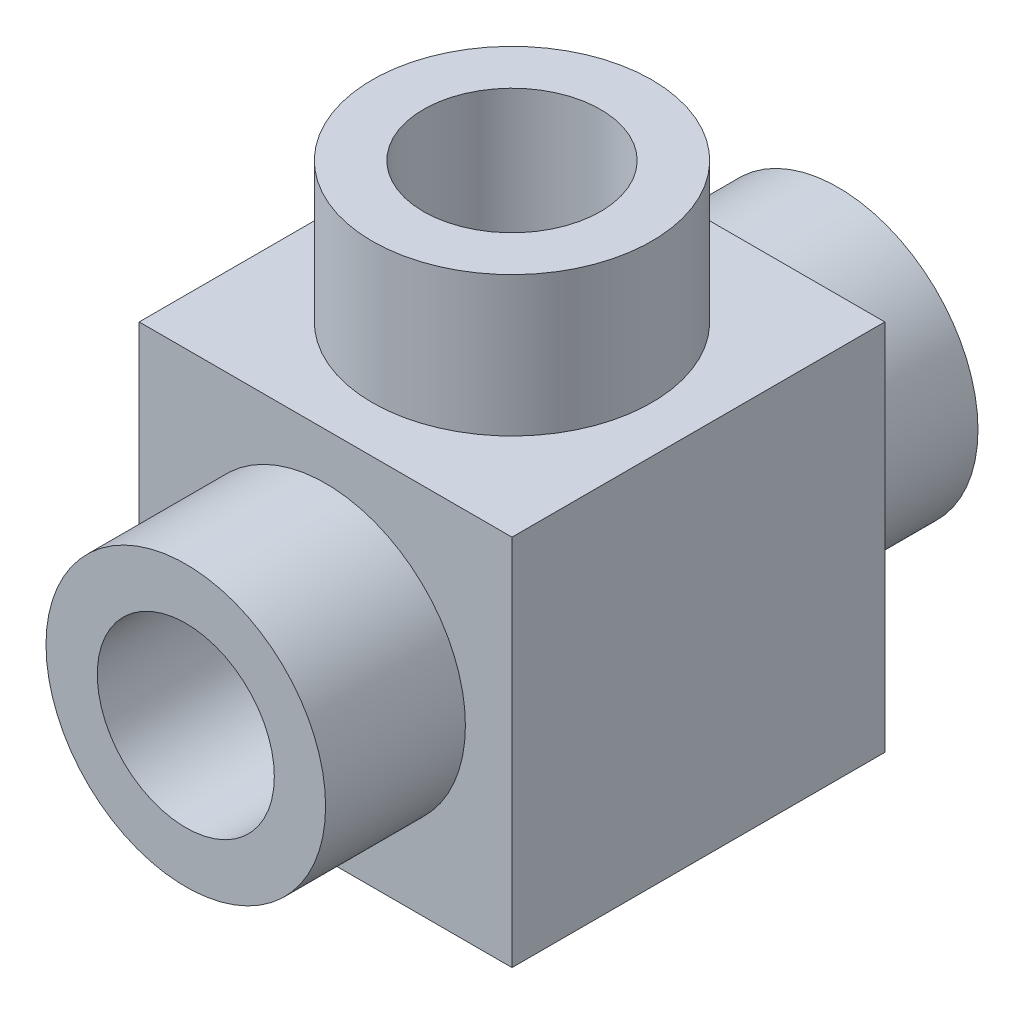
ISO-10303-21;
HEADER;
FILE_DESCRIPTION(('STEP AP214'),'2;1');
FILE_NAME('part.step','',(''),(''),'','','');
FILE_SCHEMA(('AUTOMOTIVE_DESIGN { 1 0 10303 214 1 1 1 1 }'));
ENDSEC;
DATA;
#1=APPLICATION_CONTEXT('core data for automotive mechanical design processes');
#2=APPLICATION_PROTOCOL_DEFINITION('international standard','automotive_design',2000,#1);
#3=PRODUCT_CONTEXT('',#1,'mechanical');
#4=PRODUCT('Part','Part','',(#3));
#5=PRODUCT_RELATED_PRODUCT_CATEGORY('part','',(#4));
#6=PRODUCT_DEFINITION_FORMATION('','',#4);
#7=PRODUCT_DEFINITION_CONTEXT('part definition',#1,'design');
#8=PRODUCT_DEFINITION('design','',#6,#7);
#9=PRODUCT_DEFINITION_SHAPE('','',#8);
#10=(LENGTH_UNIT() NAMED_UNIT(*) SI_UNIT(.MILLI.,.METRE.));
#11=(NAMED_UNIT(*) PLANE_ANGLE_UNIT() SI_UNIT($,.RADIAN.));
#12=(NAMED_UNIT(*) SI_UNIT($,.STERADIAN.) SOLID_ANGLE_UNIT());
#13=UNCERTAINTY_MEASURE_WITH_UNIT(LENGTH_MEASURE(1.E-05),#10,'distance_accuracy_value','');
#14=(GEOMETRIC_REPRESENTATION_CONTEXT(3) GLOBAL_UNCERTAINTY_ASSIGNED_CONTEXT((#13)) GLOBAL_UNIT_ASSIGNED_CONTEXT((#10,
#11,#12)) REPRESENTATION_CONTEXT('',''));
#15=CARTESIAN_POINT('',(0.,0.,0.));
#16=DIRECTION('',(0.,0.,1.));
#17=DIRECTION('',(1.,0.,0.));
#18=AXIS2_PLACEMENT_3D('',#15,#16,#17);
#19=CARTESIAN_POINT('',(0.,0.,30.));
#20=DIRECTION('',(0.,0.,1.));
#21=DIRECTION('',(1.,0.,0.));
#22=AXIS2_PLACEMENT_3D('',#19,#20,#21);
#23=PLANE('',#22);
#24=CARTESIAN_POINT('',(0.,0.,30.));
#25=DIRECTION('',(0.,0.,1.));
#26=DIRECTION('',(1.,0.,0.));
#27=AXIS2_PLACEMENT_3D('',#24,#25,#26);
#28=CIRCLE('',#27,30.);
#29=CARTESIAN_POINT('',(30.,0.,30.));
#30=VERTEX_POINT('',#29);
#31=EDGE_CURVE('E123',#30,#30,#28,.T.);
#32=ORIENTED_EDGE('',*,*,#31,.T.);
#33=EDGE_LOOP('',(#32));
#34=FACE_BOUND('',#33,.T.);
#35=CARTESIAN_POINT('',(0.,0.,30.));
#36=DIRECTION('',(0.,0.,1.));
#37=DIRECTION('',(1.,0.,0.));
#38=AXIS2_PLACEMENT_3D('',#35,#36,#37);
#39=CIRCLE('',#38,19.);
#40=CARTESIAN_POINT('',(19.,0.,30.));
#41=VERTEX_POINT('',#40);
#42=EDGE_CURVE('E120',#41,#41,#39,.T.);
#43=ORIENTED_EDGE('',*,*,#42,.F.);
#44=EDGE_LOOP('',(#43));
#45=FACE_BOUND('',#44,.T.);
#46=ADVANCED_FACE('F35',(#34,#45),#23,.T.);
#47=CARTESIAN_POINT('',(0.,0.,30.));
#48=DIRECTION('',(0.,0.,-1.));
#49=DIRECTION('',(-1.,0.,0.));
#50=AXIS2_PLACEMENT_3D('',#47,#48,#49);
#51=CYLINDRICAL_SURFACE('',#50,30.);
#52=ORIENTED_EDGE('',*,*,#31,.F.);
#53=EDGE_LOOP('',(#52));
#54=FACE_BOUND('',#53,.T.);
#55=CARTESIAN_POINT('',(0.,0.,0.));
#56=DIRECTION('',(0.,0.,-1.));
#57=DIRECTION('',(-1.,0.,0.));
#58=AXIS2_PLACEMENT_3D('',#55,#56,#57);
#59=CIRCLE('',#58,30.);
#60=CARTESIAN_POINT('',(-30.,0.,0.));
#61=VERTEX_POINT('',#60);
#62=EDGE_CURVE('E114',#61,#61,#59,.T.);
#63=ORIENTED_EDGE('',*,*,#62,.F.);
#64=EDGE_LOOP('',(#63));
#65=FACE_BOUND('',#64,.T.);
#66=ADVANCED_FACE('F37',(#54,#65),#51,.T.);
#67=CARTESIAN_POINT('',(0.,0.,30.));
#68=DIRECTION('',(0.,0.,-1.));
#69=DIRECTION('',(-1.,0.,0.));
#70=AXIS2_PLACEMENT_3D('',#67,#68,#69);
#71=CYLINDRICAL_SURFACE('',#70,19.);
#72=ORIENTED_EDGE('',*,*,#42,.T.);
#73=EDGE_LOOP('',(#72));
#74=FACE_BOUND('',#73,.T.);
#75=CARTESIAN_POINT('',(0.,0.,0.));
#76=DIRECTION('',(0.,0.,1.));
#77=DIRECTION('',(1.,0.,0.));
#78=AXIS2_PLACEMENT_3D('',#75,#76,#77);
#79=CIRCLE('',#78,19.);
#80=CARTESIAN_POINT('',(19.,0.,0.));
#81=VERTEX_POINT('',#80);
#82=EDGE_CURVE('E119',#81,#81,#79,.T.);
#83=ORIENTED_EDGE('',*,*,#82,.F.);
#84=EDGE_LOOP('',(#83));
#85=FACE_BOUND('',#84,.T.);
#86=ADVANCED_FACE('F157',(#74,#85),#71,.F.);
#87=CARTESIAN_POINT('',(0.,0.,0.));
#88=DIRECTION('',(0.,0.,-1.));
#89=DIRECTION('',(-1.,0.,0.));
#90=AXIS2_PLACEMENT_3D('',#87,#88,#89);
#91=PLANE('',#90);
#92=ORIENTED_EDGE('',*,*,#82,.T.);
#93=EDGE_LOOP('',(#92));
#94=FACE_BOUND('',#93,.T.);
#95=ADVANCED_FACE('F163',(#94),#91,.F.);
#96=CARTESIAN_POINT('',(-40.,40.,-80.));
#97=DIRECTION('',(-1.,0.,0.));
#98=DIRECTION('',(0.,0.,1.));
#99=AXIS2_PLACEMENT_3D('',#96,#97,#98);
#100=PLANE('',#99);
#101=DIRECTION('',(0.,-1.,0.));
#102=VECTOR('',#101,1.);
#103=CARTESIAN_POINT('',(-40.,40.,0.));
#104=LINE('',#103,#102);
#105=CARTESIAN_POINT('',(-40.,40.,0.));
#106=VERTEX_POINT('',#105);
#107=CARTESIAN_POINT('',(-40.,-40.,0.));
#108=VERTEX_POINT('',#107);
#109=EDGE_CURVE('E104',#106,#108,#104,.T.);
#110=ORIENTED_EDGE('',*,*,#109,.F.);
#111=DIRECTION('',(0.,0.,1.));
#112=VECTOR('',#111,1.);
#113=CARTESIAN_POINT('',(-40.,40.,-80.));
#114=LINE('',#113,#112);
#115=CARTESIAN_POINT('',(-40.,40.,-80.));
#116=VERTEX_POINT('',#115);
#117=EDGE_CURVE('E52',#116,#106,#114,.T.);
#118=ORIENTED_EDGE('',*,*,#117,.F.);
#119=DIRECTION('',(0.,-1.,0.));
#120=VECTOR('',#119,1.);
#121=CARTESIAN_POINT('',(-40.,40.,-80.));
#122=LINE('',#121,#120);
#123=CARTESIAN_POINT('',(-40.,-40.,-80.));
#124=VERTEX_POINT('',#123);
#125=EDGE_CURVE('E97',#116,#124,#122,.T.);
#126=ORIENTED_EDGE('',*,*,#125,.T.);
#127=DIRECTION('',(0.,0.,1.));
#128=VECTOR('',#127,1.);
#129=CARTESIAN_POINT('',(-40.,-40.,-80.));
#130=LINE('',#129,#128);
#131=EDGE_CURVE('E80',#124,#108,#130,.T.);
#132=ORIENTED_EDGE('',*,*,#131,.T.);
#133=EDGE_LOOP('',(#110,#118,#126,#132));
#134=FACE_BOUND('',#133,.T.);
#135=ADVANCED_FACE('F150',(#134),#100,.T.);
#136=CARTESIAN_POINT('',(40.,40.,-80.));
#137=DIRECTION('',(0.,1.,0.));
#138=DIRECTION('',(0.,0.,1.));
#139=AXIS2_PLACEMENT_3D('',#136,#137,#138);
#140=PLANE('',#139);
#141=CARTESIAN_POINT('',(0.,40.,-40.));
#142=DIRECTION('',(0.,1.,0.));
#143=DIRECTION('',(0.,0.,1.));
#144=AXIS2_PLACEMENT_3D('',#141,#142,#143);
#145=CIRCLE('',#144,30.);
#146=CARTESIAN_POINT('',(0.,40.,-10.));
#147=VERTEX_POINT('',#146);
#148=EDGE_CURVE('E347',#147,#147,#145,.T.);
#149=ORIENTED_EDGE('',*,*,#148,.F.);
#150=EDGE_LOOP('',(#149));
#151=FACE_BOUND('',#150,.T.);
#152=DIRECTION('',(-1.,0.,0.));
#153=VECTOR('',#152,1.);
#154=CARTESIAN_POINT('',(40.,40.,0.));
#155=LINE('',#154,#153);
#156=CARTESIAN_POINT('',(40.,40.,0.));
#157=VERTEX_POINT('',#156);
#158=EDGE_CURVE('E99',#157,#106,#155,.T.);
#159=ORIENTED_EDGE('',*,*,#158,.F.);
#160=DIRECTION('',(0.,0.,1.));
#161=VECTOR('',#160,1.);
#162=CARTESIAN_POINT('',(40.,40.,-80.));
#163=LINE('',#162,#161);
#164=CARTESIAN_POINT('',(40.,40.,-80.));
#165=VERTEX_POINT('',#164);
#166=EDGE_CURVE('E69',#165,#157,#163,.T.);
#167=ORIENTED_EDGE('',*,*,#166,.F.);
#168=DIRECTION('',(-1.,0.,0.));
#169=VECTOR('',#168,1.);
#170=CARTESIAN_POINT('',(40.,40.,-80.));
#171=LINE('',#170,#169);
#172=EDGE_CURVE('E94',#165,#116,#171,.T.);
#173=ORIENTED_EDGE('',*,*,#172,.T.);
#174=ORIENTED_EDGE('',*,*,#117,.T.);
#175=EDGE_LOOP('',(#159,#167,#173,#174));
#176=FACE_BOUND('',#175,.T.);
#177=ADVANCED_FACE('F136',(#151,#176),#140,.T.);
#178=CARTESIAN_POINT('',(40.,40.,-80.));
#179=DIRECTION('',(1.,0.,0.));
#180=DIRECTION('',(0.,1.,0.));
#181=AXIS2_PLACEMENT_3D('',#178,#179,#180);
#182=PLANE('',#181);
#183=DIRECTION('',(0.,1.,0.));
#184=VECTOR('',#183,1.);
#185=CARTESIAN_POINT('',(40.,40.,0.));
#186=LINE('',#185,#184);
#187=CARTESIAN_POINT('',(40.,-40.,0.));
#188=VERTEX_POINT('',#187);
#189=EDGE_CURVE('E88',#188,#157,#186,.T.);
#190=ORIENTED_EDGE('',*,*,#189,.F.);
#191=DIRECTION('',(0.,0.,1.));
#192=VECTOR('',#191,1.);
#193=CARTESIAN_POINT('',(40.,-40.,-80.));
#194=LINE('',#193,#192);
#195=CARTESIAN_POINT('',(40.,-40.,-80.));
#196=VERTEX_POINT('',#195);
#197=EDGE_CURVE('E83',#196,#188,#194,.T.);
#198=ORIENTED_EDGE('',*,*,#197,.F.);
#199=DIRECTION('',(0.,1.,0.));
#200=VECTOR('',#199,1.);
#201=CARTESIAN_POINT('',(40.,40.,-80.));
#202=LINE('',#201,#200);
#203=EDGE_CURVE('E86',#196,#165,#202,.T.);
#204=ORIENTED_EDGE('',*,*,#203,.T.);
#205=ORIENTED_EDGE('',*,*,#166,.T.);
#206=EDGE_LOOP('',(#190,#198,#204,#205));
#207=FACE_BOUND('',#206,.T.);
#208=ADVANCED_FACE('F85',(#207),#182,.T.);
#209=CARTESIAN_POINT('',(40.,-40.,-80.));
#210=DIRECTION('',(0.,-1.,0.));
#211=DIRECTION('',(0.,0.,-1.));
#212=AXIS2_PLACEMENT_3D('',#209,#210,#211);
#213=PLANE('',#212);
#214=DIRECTION('',(1.,0.,0.));
#215=VECTOR('',#214,1.);
#216=CARTESIAN_POINT('',(40.,-40.,0.));
#217=LINE('',#216,#215);
#218=EDGE_CURVE('E107',#108,#188,#217,.T.);
#219=ORIENTED_EDGE('',*,*,#218,.F.);
#220=ORIENTED_EDGE('',*,*,#131,.F.);
#221=DIRECTION('',(1.,0.,0.));
#222=VECTOR('',#221,1.);
#223=CARTESIAN_POINT('',(40.,-40.,-80.));
#224=LINE('',#223,#222);
#225=EDGE_CURVE('E93',#124,#196,#224,.T.);
#226=ORIENTED_EDGE('',*,*,#225,.T.);
#227=ORIENTED_EDGE('',*,*,#197,.T.);
#228=EDGE_LOOP('',(#219,#220,#226,#227));
#229=FACE_BOUND('',#228,.T.);
#230=ADVANCED_FACE('F96',(#229),#213,.T.);
#231=CARTESIAN_POINT('',(0.,0.,-80.));
#232=DIRECTION('',(0.,0.,-1.));
#233=DIRECTION('',(-1.,0.,0.));
#234=AXIS2_PLACEMENT_3D('',#231,#232,#233);
#235=PLANE('',#234);
#236=CARTESIAN_POINT('',(0.,0.,-80.));
#237=DIRECTION('',(0.,0.,-1.));
#238=DIRECTION('',(-1.,0.,0.));
#239=AXIS2_PLACEMENT_3D('',#236,#237,#238);
#240=CIRCLE('',#239,30.);
#241=CARTESIAN_POINT('',(-30.,0.,-80.));
#242=VERTEX_POINT('',#241);
#243=EDGE_CURVE('E11',#242,#242,#240,.T.);
#244=ORIENTED_EDGE('',*,*,#243,.F.);
#245=EDGE_LOOP('',(#244));
#246=FACE_BOUND('',#245,.T.);
#247=ORIENTED_EDGE('',*,*,#125,.F.);
#248=ORIENTED_EDGE('',*,*,#172,.F.);
#249=ORIENTED_EDGE('',*,*,#203,.F.);
#250=ORIENTED_EDGE('',*,*,#225,.F.);
#251=EDGE_LOOP('',(#247,#248,#249,#250));
#252=FACE_BOUND('',#251,.T.);
#253=ADVANCED_FACE('F92',(#246,#252),#235,.T.);
#254=ORIENTED_EDGE('',*,*,#62,.T.);
#255=EDGE_LOOP('',(#254));
#256=FACE_BOUND('',#255,.T.);
#257=ORIENTED_EDGE('',*,*,#109,.T.);
#258=ORIENTED_EDGE('',*,*,#218,.T.);
#259=ORIENTED_EDGE('',*,*,#189,.T.);
#260=ORIENTED_EDGE('',*,*,#158,.T.);
#261=EDGE_LOOP('',(#257,#258,#259,#260));
#262=FACE_BOUND('',#261,.T.);
#263=ADVANCED_FACE('F185',(#256,#262),#91,.F.);
#264=CARTESIAN_POINT('',(0.,70.,-40.));
#265=DIRECTION('',(0.,1.,0.));
#266=DIRECTION('',(0.,0.,1.));
#267=AXIS2_PLACEMENT_3D('',#264,#265,#266);
#268=PLANE('',#267);
#269=CARTESIAN_POINT('',(0.,70.,-40.));
#270=DIRECTION('',(0.,1.,0.));
#271=DIRECTION('',(0.,0.,1.));
#272=AXIS2_PLACEMENT_3D('',#269,#270,#271);
#273=CIRCLE('',#272,30.);
#274=CARTESIAN_POINT('',(0.,70.,-10.));
#275=VERTEX_POINT('',#274);
#276=EDGE_CURVE('E108',#275,#275,#273,.T.);
#277=ORIENTED_EDGE('',*,*,#276,.T.);
#278=EDGE_LOOP('',(#277));
#279=FACE_BOUND('',#278,.T.);
#280=CARTESIAN_POINT('',(0.,70.,-40.));
#281=DIRECTION('',(0.,1.,0.));
#282=DIRECTION('',(0.,0.,1.));
#283=AXIS2_PLACEMENT_3D('',#280,#281,#282);
#284=CIRCLE('',#283,19.);
#285=CARTESIAN_POINT('',(0.,70.,-21.));
#286=VERTEX_POINT('',#285);
#287=EDGE_CURVE('E344',#286,#286,#284,.T.);
#288=ORIENTED_EDGE('',*,*,#287,.F.);
#289=EDGE_LOOP('',(#288));
#290=FACE_BOUND('',#289,.T.);
#291=ADVANCED_FACE('F195',(#279,#290),#268,.T.);
#292=CARTESIAN_POINT('',(0.,70.,-40.));
#293=DIRECTION('',(0.,-1.,0.));
#294=DIRECTION('',(0.,0.,-1.));
#295=AXIS2_PLACEMENT_3D('',#292,#293,#294);
#296=CYLINDRICAL_SURFACE('',#295,30.);
#297=ORIENTED_EDGE('',*,*,#276,.F.);
#298=EDGE_LOOP('',(#297));
#299=FACE_BOUND('',#298,.T.);
#300=ORIENTED_EDGE('',*,*,#148,.T.);
#301=EDGE_LOOP('',(#300));
#302=FACE_BOUND('',#301,.T.);
#303=ADVANCED_FACE('F144',(#299,#302),#296,.T.);
#304=CARTESIAN_POINT('',(0.,70.,-40.));
#305=DIRECTION('',(0.,-1.,0.));
#306=DIRECTION('',(0.,0.,-1.));
#307=AXIS2_PLACEMENT_3D('',#304,#305,#306);
#308=CYLINDRICAL_SURFACE('',#307,19.);
#309=ORIENTED_EDGE('',*,*,#287,.T.);
#310=EDGE_LOOP('',(#309));
#311=FACE_BOUND('',#310,.T.);
#312=CARTESIAN_POINT('',(0.,40.,-40.));
#313=DIRECTION('',(0.,1.,0.));
#314=DIRECTION('',(0.,0.,1.));
#315=AXIS2_PLACEMENT_3D('',#312,#313,#314);
#316=CIRCLE('',#315,19.);
#317=CARTESIAN_POINT('',(0.,40.,-21.));
#318=VERTEX_POINT('',#317);
#319=EDGE_CURVE('E44',#318,#318,#316,.F.);
#320=ORIENTED_EDGE('',*,*,#319,.T.);
#321=EDGE_LOOP('',(#320));
#322=FACE_BOUND('',#321,.T.);
#323=ADVANCED_FACE('F130',(#311,#322),#308,.F.);
#324=ORIENTED_EDGE('',*,*,#319,.F.);
#325=EDGE_LOOP('',(#324));
#326=FACE_BOUND('',#325,.T.);
#327=ADVANCED_FACE('F132',(#326),#140,.T.);
#328=CARTESIAN_POINT('',(0.,0.,-110.));
#329=DIRECTION('',(0.,0.,1.));
#330=DIRECTION('',(1.,0.,0.));
#331=AXIS2_PLACEMENT_3D('',#328,#329,#330);
#332=CYLINDRICAL_SURFACE('',#331,30.);
#333=CARTESIAN_POINT('',(0.,0.,-110.));
#334=DIRECTION('',(0.,0.,1.));
#335=DIRECTION('',(1.,0.,0.));
#336=AXIS2_PLACEMENT_3D('',#333,#334,#335);
#337=CIRCLE('',#336,30.);
#338=CARTESIAN_POINT('',(30.,0.,-110.));
#339=VERTEX_POINT('',#338);
#340=EDGE_CURVE('E339',#339,#339,#337,.T.);
#341=ORIENTED_EDGE('',*,*,#340,.T.);
#342=EDGE_LOOP('',(#341));
#343=FACE_BOUND('',#342,.T.);
#344=ORIENTED_EDGE('',*,*,#243,.T.);
#345=EDGE_LOOP('',(#344));
#346=FACE_BOUND('',#345,.T.);
#347=ADVANCED_FACE('F134',(#343,#346),#332,.T.);
#348=CARTESIAN_POINT('',(0.,0.,-110.));
#349=DIRECTION('',(0.,0.,1.));
#350=DIRECTION('',(1.,0.,0.));
#351=AXIS2_PLACEMENT_3D('',#348,#349,#350);
#352=PLANE('',#351);
#353=CARTESIAN_POINT('',(0.,0.,-110.));
#354=DIRECTION('',(0.,0.,1.));
#355=DIRECTION('',(1.,0.,0.));
#356=AXIS2_PLACEMENT_3D('',#353,#354,#355);
#357=CIRCLE('',#356,19.);
#358=CARTESIAN_POINT('',(19.,0.,-110.));
#359=VERTEX_POINT('',#358);
#360=EDGE_CURVE('E334',#359,#359,#357,.T.);
#361=ORIENTED_EDGE('',*,*,#360,.T.);
#362=EDGE_LOOP('',(#361));
#363=FACE_BOUND('',#362,.T.);
#364=ORIENTED_EDGE('',*,*,#340,.F.);
#365=EDGE_LOOP('',(#364));
#366=FACE_BOUND('',#365,.T.);
#367=ADVANCED_FACE('F141',(#363,#366),#352,.F.);
#368=CARTESIAN_POINT('',(0.,0.,-110.));
#369=DIRECTION('',(0.,0.,1.));
#370=DIRECTION('',(1.,0.,0.));
#371=AXIS2_PLACEMENT_3D('',#368,#369,#370);
#372=CYLINDRICAL_SURFACE('',#371,19.);
#373=ORIENTED_EDGE('',*,*,#360,.F.);
#374=EDGE_LOOP('',(#373));
#375=FACE_BOUND('',#374,.T.);
#376=CARTESIAN_POINT('',(0.,0.,-80.));
#377=DIRECTION('',(0.,0.,1.));
#378=DIRECTION('',(1.,0.,0.));
#379=AXIS2_PLACEMENT_3D('',#376,#377,#378);
#380=CIRCLE('',#379,19.);
#381=CARTESIAN_POINT('',(19.,0.,-80.));
#382=VERTEX_POINT('',#381);
#383=EDGE_CURVE('E337',#382,#382,#380,.T.);
#384=ORIENTED_EDGE('',*,*,#383,.T.);
#385=EDGE_LOOP('',(#384));
#386=FACE_BOUND('',#385,.T.);
#387=ADVANCED_FACE('F239',(#375,#386),#372,.F.);
#388=ORIENTED_EDGE('',*,*,#383,.F.);
#389=EDGE_LOOP('',(#388));
#390=FACE_BOUND('',#389,.T.);
#391=ADVANCED_FACE('F188',(#390),#235,.T.);
#392=CLOSED_SHELL('',(#46,#66,#86,#95,#135,#177,#208,#230,#253,#263,#291,#303,#323,#327,#347,
#367,#387,#391));
#393=MANIFOLD_SOLID_BREP('B2',#392);
#394=ADVANCED_BREP_SHAPE_REPRESENTATION('',(#18,#393),#14);
#395=SHAPE_DEFINITION_REPRESENTATION(#9,#394);
ENDSEC;
END-ISO-10303-21;
